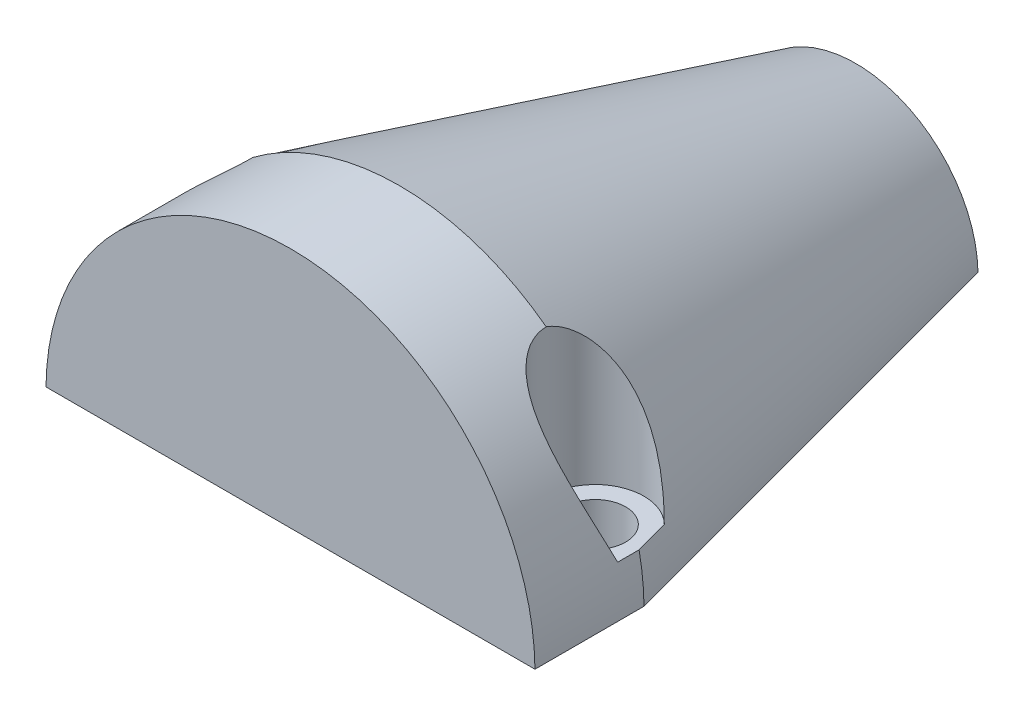
ISO-10303-21;
HEADER;
FILE_DESCRIPTION(('STEP AP214'),'2;1');
FILE_NAME('part.step','',(''),(''),'','','');
FILE_SCHEMA(('AUTOMOTIVE_DESIGN { 1 0 10303 214 1 1 1 1 }'));
ENDSEC;
DATA;
#1=APPLICATION_CONTEXT('core data for automotive mechanical design processes');
#2=APPLICATION_PROTOCOL_DEFINITION('international standard','automotive_design',2000,#1);
#3=PRODUCT_CONTEXT('',#1,'mechanical');
#4=PRODUCT('Part','Part','',(#3));
#5=PRODUCT_RELATED_PRODUCT_CATEGORY('part','',(#4));
#6=PRODUCT_DEFINITION_FORMATION('','',#4);
#7=PRODUCT_DEFINITION_CONTEXT('part definition',#1,'design');
#8=PRODUCT_DEFINITION('design','',#6,#7);
#9=PRODUCT_DEFINITION_SHAPE('','',#8);
#10=(LENGTH_UNIT() NAMED_UNIT(*) SI_UNIT(.MILLI.,.METRE.));
#11=(NAMED_UNIT(*) PLANE_ANGLE_UNIT() SI_UNIT($,.RADIAN.));
#12=(NAMED_UNIT(*) SI_UNIT($,.STERADIAN.) SOLID_ANGLE_UNIT());
#13=UNCERTAINTY_MEASURE_WITH_UNIT(LENGTH_MEASURE(1.E-05),#10,'distance_accuracy_value','');
#14=(GEOMETRIC_REPRESENTATION_CONTEXT(3) GLOBAL_UNCERTAINTY_ASSIGNED_CONTEXT((#13)) GLOBAL_UNIT_ASSIGNED_CONTEXT((#10,
#11,#12)) REPRESENTATION_CONTEXT('',''));
#15=CARTESIAN_POINT('',(0.,0.,0.));
#16=DIRECTION('',(0.,0.,1.));
#17=DIRECTION('',(1.,0.,0.));
#18=AXIS2_PLACEMENT_3D('',#15,#16,#17);
#19=CARTESIAN_POINT('',(0.,0.,-58.7248));
#20=DIRECTION('',(0.,0.,1.));
#21=DIRECTION('',(1.,0.,0.));
#22=AXIS2_PLACEMENT_3D('',#19,#20,#21);
#23=CYLINDRICAL_SURFACE('',#22,12.7);
#24=CARTESIAN_POINT('',(0.,0.,-35.0262773719376));
#25=DIRECTION('',(0.,0.,1.));
#26=DIRECTION('',(1.,0.,0.));
#27=AXIS2_PLACEMENT_3D('',#24,#25,#26);
#28=CIRCLE('',#27,12.7);
#29=CARTESIAN_POINT('',(7.62,10.16,-35.0262773719376));
#30=VERTEX_POINT('',#29);
#31=CARTESIAN_POINT('',(-7.62,10.16,-35.0262773719376));
#32=VERTEX_POINT('',#31);
#33=EDGE_CURVE('E112',#30,#32,#28,.T.);
#34=ORIENTED_EDGE('',*,*,#33,.T.);
#35=CARTESIAN_POINT('',(-12.4434078933385,2.54,-36.138773840534));
#36=CARTESIAN_POINT('',(-12.4106404932833,2.70051217003802,-36.2060156484439));
#37=CARTESIAN_POINT('',(-12.3746901179144,2.86079640095324,-36.2722713840303));
#38=CARTESIAN_POINT('',(-12.2963213923528,3.18082515908239,-36.4023243300552));
#39=CARTESIAN_POINT('',(-12.2539014911004,3.34056954745702,-36.466120946316));
#40=CARTESIAN_POINT('',(-12.162295816997,3.66009538455141,-36.5910249041812));
#41=CARTESIAN_POINT('',(-12.1130796355434,3.81987358225332,-36.6521184309757));
#42=CARTESIAN_POINT('',(-12.0079463618182,4.13852480136973,-36.7706887319838));
#43=CARTESIAN_POINT('',(-11.9520297748422,4.29739789009557,-36.828165778428));
#44=CARTESIAN_POINT('',(-11.7729807683343,4.7752753004494,-36.9952175468779));
#45=CARTESIAN_POINT('',(-11.6393290720681,5.09279377577872,-37.0983203245143));
#46=CARTESIAN_POINT('',(-11.4176934792722,5.56384285378942,-37.234737523135));
#47=CARTESIAN_POINT('',(-11.3403643685056,5.71985550880714,-37.2771417026836));
#48=CARTESIAN_POINT('',(-11.1785735557074,6.02992894801275,-37.3548313453031));
#49=CARTESIAN_POINT('',(-11.094114088835,6.18399032658193,-37.3901190275211));
#50=CARTESIAN_POINT('',(-10.9395956251811,6.45236552465443,-37.4447072475281));
#51=CARTESIAN_POINT('',(-10.8710602717988,6.5671936803413,-37.4658073446423));
#52=CARTESIAN_POINT('',(-10.7299775069151,6.79525994475454,-37.5025730887976));
#53=CARTESIAN_POINT('',(-10.657430098056,6.90849805452802,-37.5182387394176));
#54=CARTESIAN_POINT('',(-10.5084947684462,7.13299846972745,-37.543388886472));
#55=CARTESIAN_POINT('',(-10.4321100447159,7.24426231872844,-37.5528784393951));
#56=CARTESIAN_POINT('',(-10.2756347679032,7.4645549272482,-37.5648568501809));
#57=CARTESIAN_POINT('',(-10.1955442656979,7.57358371742274,-37.5673458041266));
#58=CARTESIAN_POINT('',(-10.0310991952555,7.79010386778702,-37.5643511210466));
#59=CARTESIAN_POINT('',(-9.94670866446787,7.89756703512684,-37.5587834357503));
#60=CARTESIAN_POINT('',(-9.77491926216904,8.10922502082775,-37.5384071584244));
#61=CARTESIAN_POINT('',(-9.68751988940299,8.21341928902977,-37.5235970195503));
#62=CARTESIAN_POINT('',(-9.51059020881198,8.41765309835135,-37.483527642801));
#63=CARTESIAN_POINT('',(-9.42106379815038,8.51769943578399,-37.4582863062521));
#64=CARTESIAN_POINT('',(-9.24084332787055,8.71289029340568,-37.3960522757407));
#65=CARTESIAN_POINT('',(-9.15015001711945,8.80803777878307,-37.3590667898374));
#66=CARTESIAN_POINT('',(-8.94620875107452,9.01562124603284,-37.2610318417203));
#67=CARTESIAN_POINT('',(-8.83300983497042,9.12640691631196,-37.1962732863556));
#68=CARTESIAN_POINT('',(-8.611084276837,9.33608426820649,-37.0438303176258));
#69=CARTESIAN_POINT('',(-8.50235231840917,9.43499037513306,-36.9561741281656));
#70=CARTESIAN_POINT('',(-8.31213273932098,9.60269835580483,-36.7731085236937));
#71=CARTESIAN_POINT('',(-8.22911529234959,9.6737731405652,-36.6813870394962));
#72=CARTESIAN_POINT('',(-8.07407892982588,9.8035433624046,-36.4810987927205));
#73=CARTESIAN_POINT('',(-8.00205759572734,9.86224152275256,-36.3725357449905));
#74=CARTESIAN_POINT('',(-7.90542931619484,9.93961410856828,-36.1980327923015));
#75=CARTESIAN_POINT('',(-7.87500540498989,9.96371312463023,-36.1376117280447));
#76=CARTESIAN_POINT('',(-7.81864864916133,10.0079974289445,-36.0133526991139));
#77=CARTESIAN_POINT('',(-7.7927134511465,10.0281847687208,-35.9495165480624));
#78=CARTESIAN_POINT('',(-7.74584851491928,10.064428103259,-35.8189199893317));
#79=CARTESIAN_POINT('',(-7.72491701596166,10.0804855514345,-35.7521606201131));
#80=CARTESIAN_POINT('',(-7.68848488166392,10.108299502319,-35.616332974433));
#81=CARTESIAN_POINT('',(-7.67298330590591,10.1200567498027,-35.5472651000576));
#82=CARTESIAN_POINT('',(-7.63872795073845,10.1459657408689,-35.3573387723015));
#83=CARTESIAN_POINT('',(-7.62558699532396,10.1558087690625,-35.2347924658732));
#84=CARTESIAN_POINT('',(-7.61729492135686,10.1620294764768,-34.9888527632129));
#85=CARTESIAN_POINT('',(-7.62213521643902,10.1584135825692,-34.8654597993654));
#86=CARTESIAN_POINT('',(-7.64849182384235,10.1385801329292,-34.6300487684962));
#87=CARTESIAN_POINT('',(-7.66885834202883,10.1232312576039,-34.5178257500126));
#88=CARTESIAN_POINT('',(-7.72371148857228,10.0814413221802,-34.2990785878541));
#89=CARTESIAN_POINT('',(-7.75819793428179,10.0550004055622,-34.1925543704827));
#90=CARTESIAN_POINT('',(-7.84067306320341,9.99082771120708,-33.9845398720463));
#91=CARTESIAN_POINT('',(-7.88903565999206,9.95278110270783,-33.8832963652108));
#92=CARTESIAN_POINT('',(-7.99635598713923,9.86676309569256,-33.6912251326956));
#93=CARTESIAN_POINT('',(-8.05531702805167,9.81878859536761,-33.6004006760975));
#94=CARTESIAN_POINT('',(-8.18842509008143,9.70813949365493,-33.4205431722038));
#95=CARTESIAN_POINT('',(-8.26353533978229,9.64441618805289,-33.3328733290485));
#96=CARTESIAN_POINT('',(-8.42046346179904,9.50771643598154,-33.1720208732124));
#97=CARTESIAN_POINT('',(-8.50228557481113,9.43473412331296,-33.098847520978));
#98=CARTESIAN_POINT('',(-8.71461003861574,9.2399023778972,-32.9312221295838));
#99=CARTESIAN_POINT('',(-8.84777980337395,9.11276606710865,-32.84626687126));
#100=CARTESIAN_POINT('',(-9.11581841077687,8.84465969539046,-32.7058688853343));
#101=CARTESIAN_POINT('',(-9.25069045469942,8.70365851539413,-32.6504944272678));
#102=CARTESIAN_POINT('',(-9.48124141176932,8.4508595407933,-32.5765170769203));
#103=CARTESIAN_POINT('',(-9.57770490946203,8.34140747217227,-32.5520298165436));
#104=CARTESIAN_POINT('',(-9.76775825440004,8.11802918179595,-32.5148777314228));
#105=CARTESIAN_POINT('',(-9.86134674383167,8.00410090218053,-32.5022184122377));
#106=CARTESIAN_POINT('',(-10.0448702014928,7.77254408245699,-32.4872163850711));
#107=CARTESIAN_POINT('',(-10.1348015117359,7.65491203670081,-32.4848837662466));
#108=CARTESIAN_POINT('',(-10.3104287800259,7.41666911221979,-32.4892147777491));
#109=CARTESIAN_POINT('',(-10.3961233187739,7.29605725529384,-32.4958814018951));
#110=CARTESIAN_POINT('',(-10.6117304097191,6.98111006257924,-32.5232164152447));
#111=CARTESIAN_POINT('',(-10.7381927119152,6.78491203169792,-32.5497933523737));
#112=CARTESIAN_POINT('',(-10.9790228403994,6.38788375166972,-32.6186863799452));
#113=CARTESIAN_POINT('',(-11.0933831702541,6.1870507241524,-32.6610121533767));
#114=CARTESIAN_POINT('',(-11.3101485362236,5.78131455829837,-32.7584771118828));
#115=CARTESIAN_POINT('',(-11.4125169216758,5.57640107261712,-32.813654113326));
#116=CARTESIAN_POINT('',(-11.6049736428323,5.16394939239367,-32.9342584089867));
#117=CARTESIAN_POINT('',(-11.6950649800691,4.95641185299676,-32.9996831893562));
#118=CARTESIAN_POINT('',(-11.8526798667538,4.56537913026074,-33.1300854898272));
#119=CARTESIAN_POINT('',(-11.9216167170454,4.38212530968016,-33.1940944374333));
#120=CARTESIAN_POINT('',(-12.0504395329373,4.01433341697475,-33.327329446642));
#121=CARTESIAN_POINT('',(-12.1103250388214,3.82979528011734,-33.3965557729668));
#122=CARTESIAN_POINT('',(-12.2206773107376,3.46145480480609,-33.5385864541603));
#123=CARTESIAN_POINT('',(-12.271227667386,3.2776619700238,-33.6113508549887));
#124=CARTESIAN_POINT('',(-12.3637261562958,2.90934458642097,-33.7602388553995));
#125=CARTESIAN_POINT('',(-12.405677114328,2.72482029833879,-33.8363613414877));
#126=CARTESIAN_POINT('',(-12.4434078933385,2.54,-33.9137809033413));
#127=B_SPLINE_CURVE_WITH_KNOTS('',3,(#35,#36,#37,#38,#39,#40,#41,#42,#43,#44,#45,#46,#47,#48,
#49,#50,#51,#52,#53,#54,#55,#56,#57,#58,#59,#60,#61,#62,#63,#64,#65,#66,#67,#68,#69,#70,#71,#72,
#73,#74,#75,#76,#77,#78,#79,#80,#81,#82,#83,#84,#85,#86,#87,#88,#89,#90,#91,#92,#93,#94,#95,#96,
#97,#98,#99,#100,#101,#102,#103,#104,#105,#106,#107,#108,#109,#110,#111,#112,#113,#114,#115,
#116,#117,#118,#119,#120,#121,#122,#123,#124,#125,#126),.UNSPECIFIED.,.F.,.F.,(4,2,2,2,2,2,2,2,
2,2,2,2,2,2,2,2,2,2,2,2,2,2,2,2,2,2,2,2,2,2,2,2,2,2,2,2,2,2,2,2,2,2,2,2,2,4),(0.,
0.531235424488071,1.06259841271496,1.59642094193124,2.1302032394547,3.20690310303408,
3.74432711486722,4.28158328102922,4.6875692311952,5.09355491398963,5.49920778904528,
5.90485509649544,6.31476481741373,6.72474316044887,7.13402082861732,7.54304778353178,
8.05467789637528,8.56568031927385,8.99205838740778,9.41834254005989,9.63350673900396,
9.8485577853311,10.0635330458599,10.2784710560176,10.6472414305073,11.0158357332595,
11.3595050560565,11.7031699334803,12.0571412780941,12.4112233827421,12.8053332210206,
13.1996940129701,13.8046003245861,14.4108967333143,14.8541195492621,15.2975485697704,
15.7414107237047,16.1854205756717,16.8891046682371,17.5932221296345,18.2994383247381,
19.0054815508635,19.6231710018872,20.2408918147059,20.8527802753675,21.4644673454182),.UNSPECIFIED.);
#128=CARTESIAN_POINT('',(-12.4434078933385,2.54,-33.9137809033413));
#129=VERTEX_POINT('',#128);
#130=EDGE_CURVE('E103',#32,#129,#127,.T.);
#131=ORIENTED_EDGE('',*,*,#130,.T.);
#132=DIRECTION('',(0.,0.,1.));
#133=VECTOR('',#132,1.);
#134=CARTESIAN_POINT('',(-12.4434078933385,2.54,-58.7248));
#135=LINE('',#134,#133);
#136=CARTESIAN_POINT('',(-12.4434078933385,2.54,-35.0262773719376));
#137=VERTEX_POINT('',#136);
#138=EDGE_CURVE('E96',#129,#137,#135,.F.);
#139=ORIENTED_EDGE('',*,*,#138,.T.);
#140=CARTESIAN_POINT('',(-12.6993649841242,0.127,-35.0262773719377));
#141=VERTEX_POINT('',#140);
#142=EDGE_CURVE('E210',#137,#141,#28,.T.);
#143=ORIENTED_EDGE('',*,*,#142,.T.);
#144=DIRECTION('',(0.,0.,1.));
#145=VECTOR('',#144,1.);
#146=CARTESIAN_POINT('',(-12.6993649841242,0.127,-58.7248));
#147=LINE('',#146,#145);
#148=CARTESIAN_POINT('',(-12.6993649841242,0.127,-29.3624));
#149=VERTEX_POINT('',#148);
#150=EDGE_CURVE('E164',#141,#149,#147,.T.);
#151=ORIENTED_EDGE('',*,*,#150,.T.);
#152=CARTESIAN_POINT('',(0.,0.,-29.3624));
#153=DIRECTION('',(0.,0.,-1.));
#154=DIRECTION('',(-1.,0.,0.));
#155=AXIS2_PLACEMENT_3D('',#152,#153,#154);
#156=CIRCLE('',#155,12.7);
#157=CARTESIAN_POINT('',(12.6993649841242,0.127,-29.3624));
#158=VERTEX_POINT('',#157);
#159=EDGE_CURVE('E158',#158,#149,#156,.F.);
#160=ORIENTED_EDGE('',*,*,#159,.F.);
#161=DIRECTION('',(0.,0.,1.));
#162=VECTOR('',#161,1.);
#163=CARTESIAN_POINT('',(12.6993649841242,0.127,-58.7248));
#164=LINE('',#163,#162);
#165=CARTESIAN_POINT('',(12.6993649841242,0.127,-35.0262773719376));
#166=VERTEX_POINT('',#165);
#167=EDGE_CURVE('E163',#166,#158,#164,.T.);
#168=ORIENTED_EDGE('',*,*,#167,.F.);
#169=CARTESIAN_POINT('',(12.4434078933385,2.54,-35.0262773719376));
#170=VERTEX_POINT('',#169);
#171=EDGE_CURVE('E226',#166,#170,#28,.T.);
#172=ORIENTED_EDGE('',*,*,#171,.T.);
#173=DIRECTION('',(0.,0.,1.));
#174=VECTOR('',#173,1.);
#175=CARTESIAN_POINT('',(12.4434078933385,2.54,-58.7248));
#176=LINE('',#175,#174);
#177=CARTESIAN_POINT('',(12.4434078933385,2.54,-33.9137809033413));
#178=VERTEX_POINT('',#177);
#179=EDGE_CURVE('E61',#178,#170,#176,.F.);
#180=ORIENTED_EDGE('',*,*,#179,.F.);
#181=CARTESIAN_POINT('',(12.4434078933385,2.54,-33.9137809033413));
#182=CARTESIAN_POINT('',(12.4106404932833,2.70051217003802,-33.8465390954314));
#183=CARTESIAN_POINT('',(12.3746901179144,2.86079640095324,-33.780283359845));
#184=CARTESIAN_POINT('',(12.2963213923528,3.18082515908239,-33.6502304138201));
#185=CARTESIAN_POINT('',(12.2539014911004,3.34056954745702,-33.5864337975593));
#186=CARTESIAN_POINT('',(12.162295816997,3.66009538455141,-33.4615298396941));
#187=CARTESIAN_POINT('',(12.1130796355434,3.81987358225332,-33.4004363128996));
#188=CARTESIAN_POINT('',(12.0079463618182,4.13852480136973,-33.2818660118915));
#189=CARTESIAN_POINT('',(11.9520297748422,4.29739789009557,-33.2243889654473));
#190=CARTESIAN_POINT('',(11.7729807683343,4.7752753004494,-33.0573371969974));
#191=CARTESIAN_POINT('',(11.6393290720681,5.09279377577873,-32.954234419361));
#192=CARTESIAN_POINT('',(11.4176934792722,5.56384285378942,-32.8178172207403));
#193=CARTESIAN_POINT('',(11.3403643685056,5.71985550880714,-32.7754130411917));
#194=CARTESIAN_POINT('',(11.1785735557074,6.02992894801275,-32.6977233985722));
#195=CARTESIAN_POINT('',(11.094114088835,6.18399032658193,-32.6624357163542));
#196=CARTESIAN_POINT('',(10.9395956251811,6.45236552465443,-32.6078474963472));
#197=CARTESIAN_POINT('',(10.8710602717988,6.5671936803413,-32.586747399233));
#198=CARTESIAN_POINT('',(10.7299775069151,6.79525994475454,-32.5499816550777));
#199=CARTESIAN_POINT('',(10.657430098056,6.90849805452802,-32.5343160044577));
#200=CARTESIAN_POINT('',(10.5084947684462,7.13299846972745,-32.5091658574033));
#201=CARTESIAN_POINT('',(10.4321100447159,7.24426231872844,-32.4996763044802));
#202=CARTESIAN_POINT('',(10.2756347679032,7.4645549272482,-32.4876978936944));
#203=CARTESIAN_POINT('',(10.1955442656979,7.57358371742274,-32.4852089397487));
#204=CARTESIAN_POINT('',(10.0310991952555,7.79010386778702,-32.4882036228287));
#205=CARTESIAN_POINT('',(9.94670866446787,7.89756703512684,-32.493771308125));
#206=CARTESIAN_POINT('',(9.77491926216904,8.10922502082775,-32.5141475854509));
#207=CARTESIAN_POINT('',(9.68751988940299,8.21341928902977,-32.528957724325));
#208=CARTESIAN_POINT('',(9.51059020881198,8.41765309835135,-32.5690271010743));
#209=CARTESIAN_POINT('',(9.42106379815038,8.51769943578399,-32.5942684376232));
#210=CARTESIAN_POINT('',(9.24084332787055,8.71289029340568,-32.6565024681346));
#211=CARTESIAN_POINT('',(9.15015001711945,8.80803777878307,-32.6934879540379));
#212=CARTESIAN_POINT('',(8.94620875107452,9.01562124603284,-32.791522902155));
#213=CARTESIAN_POINT('',(8.83300983497042,9.12640691631196,-32.8562814575196));
#214=CARTESIAN_POINT('',(8.611084276837,9.33608426820649,-33.0087244262495));
#215=CARTESIAN_POINT('',(8.50235231840917,9.43499037513306,-33.0963806157097));
#216=CARTESIAN_POINT('',(8.31213273932098,9.60269835580483,-33.2794462201816));
#217=CARTESIAN_POINT('',(8.22911529234959,9.6737731405652,-33.3711677043791));
#218=CARTESIAN_POINT('',(8.07407892982588,9.8035433624046,-33.5714559511548));
#219=CARTESIAN_POINT('',(8.00205759572734,9.86224152275256,-33.6800189988848));
#220=CARTESIAN_POINT('',(7.90542931619484,9.93961410856828,-33.8545219515738));
#221=CARTESIAN_POINT('',(7.87500540498989,9.96371312463023,-33.9149430158306));
#222=CARTESIAN_POINT('',(7.81864864916133,10.0079974289445,-34.0392020447614));
#223=CARTESIAN_POINT('',(7.7927134511465,10.0281847687208,-34.1030381958129));
#224=CARTESIAN_POINT('',(7.74584851491928,10.064428103259,-34.2336347545436));
#225=CARTESIAN_POINT('',(7.72491701596166,10.0804855514345,-34.3003941237622));
#226=CARTESIAN_POINT('',(7.68848488166392,10.108299502319,-34.4362217694423));
#227=CARTESIAN_POINT('',(7.67298330590591,10.1200567498027,-34.5052896438177));
#228=CARTESIAN_POINT('',(7.63872795073845,10.1459657408689,-34.6952159715738));
#229=CARTESIAN_POINT('',(7.62558699532396,10.1558087690625,-34.8177622780021));
#230=CARTESIAN_POINT('',(7.61729492135686,10.1620294764768,-35.0637019806624));
#231=CARTESIAN_POINT('',(7.62213521643902,10.1584135825692,-35.1870949445099));
#232=CARTESIAN_POINT('',(7.64849182384235,10.1385801329292,-35.4225059753791));
#233=CARTESIAN_POINT('',(7.66885834202883,10.1232312576039,-35.5347289938626));
#234=CARTESIAN_POINT('',(7.72371148857228,10.0814413221802,-35.7534761560212));
#235=CARTESIAN_POINT('',(7.75819793428179,10.0550004055622,-35.8600003733926));
#236=CARTESIAN_POINT('',(7.84067306320341,9.99082771120708,-36.068014871829));
#237=CARTESIAN_POINT('',(7.88903565999206,9.95278110270783,-36.1692583786645));
#238=CARTESIAN_POINT('',(7.99635598713923,9.86676309569256,-36.3613296111797));
#239=CARTESIAN_POINT('',(8.05531702805167,9.81878859536761,-36.4521540677778));
#240=CARTESIAN_POINT('',(8.18842509008143,9.70813949365493,-36.6320115716715));
#241=CARTESIAN_POINT('',(8.26353533978229,9.64441618805289,-36.7196814148268));
#242=CARTESIAN_POINT('',(8.42046346179903,9.50771643598154,-36.8805338706629));
#243=CARTESIAN_POINT('',(8.50228557481113,9.43473412331296,-36.9537072228973));
#244=CARTESIAN_POINT('',(8.71461003861574,9.2399023778972,-37.1213326142915));
#245=CARTESIAN_POINT('',(8.84777980337395,9.11276606710865,-37.2062878726152));
#246=CARTESIAN_POINT('',(9.11581841077687,8.84465969539046,-37.346685858541));
#247=CARTESIAN_POINT('',(9.25069045469942,8.70365851539413,-37.4020603166075));
#248=CARTESIAN_POINT('',(9.48124141176932,8.4508595407933,-37.476037666955));
#249=CARTESIAN_POINT('',(9.57770490946203,8.34140747217227,-37.5005249273317));
#250=CARTESIAN_POINT('',(9.76775825440004,8.11802918179595,-37.5376770124525));
#251=CARTESIAN_POINT('',(9.86134674383167,8.00410090218053,-37.5503363316376));
#252=CARTESIAN_POINT('',(10.0448702014928,7.77254408245699,-37.5653383588042));
#253=CARTESIAN_POINT('',(10.1348015117359,7.65491203670081,-37.5676709776287));
#254=CARTESIAN_POINT('',(10.3104287800259,7.41666911221979,-37.5633399661262));
#255=CARTESIAN_POINT('',(10.3961233187739,7.29605725529384,-37.5566733419802));
#256=CARTESIAN_POINT('',(10.6117304097191,6.98111006257924,-37.5293383286306));
#257=CARTESIAN_POINT('',(10.7381927119152,6.78491203169792,-37.5027613915016));
#258=CARTESIAN_POINT('',(10.9790228403994,6.38788375166972,-37.4338683639301));
#259=CARTESIAN_POINT('',(11.0933831702541,6.1870507241524,-37.3915425904986));
#260=CARTESIAN_POINT('',(11.3101485362236,5.78131455829837,-37.2940776319925));
#261=CARTESIAN_POINT('',(11.4125169216758,5.57640107261712,-37.2389006305493));
#262=CARTESIAN_POINT('',(11.6049736428323,5.16394939239367,-37.1182963348886));
#263=CARTESIAN_POINT('',(11.6950649800691,4.95641185299675,-37.0528715545191));
#264=CARTESIAN_POINT('',(11.8526798667538,4.56537913026074,-36.9224692540481));
#265=CARTESIAN_POINT('',(11.9216167170454,4.38212530968015,-36.858460306442));
#266=CARTESIAN_POINT('',(12.0504395329373,4.01433341697474,-36.7252252972333));
#267=CARTESIAN_POINT('',(12.1103250388214,3.82979528011733,-36.6559989709085));
#268=CARTESIAN_POINT('',(12.2206773107376,3.46145480480609,-36.513968289715));
#269=CARTESIAN_POINT('',(12.271227667386,3.2776619700238,-36.4412038888866));
#270=CARTESIAN_POINT('',(12.3637261562958,2.90934458642097,-36.2923158884758));
#271=CARTESIAN_POINT('',(12.405677114328,2.72482029833879,-36.2161934023876));
#272=CARTESIAN_POINT('',(12.4434078933385,2.54,-36.138773840534));
#273=B_SPLINE_CURVE_WITH_KNOTS('',3,(#181,#182,#183,#184,#185,#186,#187,#188,#189,#190,#191,
#192,#193,#194,#195,#196,#197,#198,#199,#200,#201,#202,#203,#204,#205,#206,#207,#208,#209,#210,
#211,#212,#213,#214,#215,#216,#217,#218,#219,#220,#221,#222,#223,#224,#225,#226,#227,#228,#229,
#230,#231,#232,#233,#234,#235,#236,#237,#238,#239,#240,#241,#242,#243,#244,#245,#246,#247,#248,
#249,#250,#251,#252,#253,#254,#255,#256,#257,#258,#259,#260,#261,#262,#263,#264,#265,#266,#267,
#268,#269,#270,#271,#272),.UNSPECIFIED.,.F.,.F.,(4,2,2,2,2,2,2,2,2,2,2,2,2,2,2,2,2,2,2,2,2,2,2,
2,2,2,2,2,2,2,2,2,2,2,2,2,2,2,2,2,2,2,2,2,2,4),(0.,0.531235424488071,1.06259841271496,
1.59642094193124,2.1302032394547,3.20690310303408,3.74432711486722,4.28158328102922,
4.6875692311952,5.09355491398963,5.49920778904528,5.90485509649544,6.31476481741373,
6.72474316044887,7.13402082861732,7.54304778353178,8.05467789637527,8.56568031927385,
8.99205838740778,9.41834254005989,9.63350673900396,9.8485577853311,10.0635330458599,
10.2784710560176,10.6472414305073,11.0158357332595,11.3595050560565,11.7031699334803,
12.0571412780941,12.4112233827421,12.8053332210205,13.1996940129701,13.8046003245861,
14.4108967333143,14.8541195492621,15.2975485697704,15.7414107237047,16.1854205756717,
16.8891046682371,17.5932221296345,18.2994383247381,19.0054815508635,19.6231710018872,
20.2408918147059,20.8527802753675,21.4644673454182),.UNSPECIFIED.);
#274=EDGE_CURVE('E144',#178,#30,#273,.T.);
#275=ORIENTED_EDGE('',*,*,#274,.T.);
#276=EDGE_LOOP('',(#34,#131,#139,#143,#151,#160,#168,#172,#180,#275));
#277=FACE_BOUND('',#276,.T.);
#278=ADVANCED_FACE('F33',(#277),#23,.T.);
#279=CARTESIAN_POINT('',(0.,0.,-35.0262773719376));
#280=DIRECTION('',(0.,0.,1.));
#281=DIRECTION('',(1.,0.,0.));
#282=AXIS2_PLACEMENT_3D('',#279,#280,#281);
#283=CONICAL_SURFACE('',#282,12.7,0.26179938779915);
#284=CARTESIAN_POINT('',(-14.8998146312197,2.54,-26.0142572542949));
#285=CARTESIAN_POINT('',(-14.6532920343515,2.54,-26.9212044294831));
#286=CARTESIAN_POINT('',(-14.4066109080176,2.54,-27.8281084944786));
#287=CARTESIAN_POINT('',(-13.9128728262181,2.54,-29.641814464323));
#288=CARTESIAN_POINT('',(-13.6658158706929,2.54,-30.5486163691555));
#289=CARTESIAN_POINT('',(-12.9239943569968,2.54,-33.2688403415854));
#290=CARTESIAN_POINT('',(-12.4285780212226,2.54,-35.0820848282492));
#291=CARTESIAN_POINT('',(-11.6835977280713,2.54,-37.8014447562093));
#292=CARTESIAN_POINT('',(-11.4349614598359,2.54,-38.7078143450266));
#293=CARTESIAN_POINT('',(-10.9369320521495,2.54,-40.5203454380746));
#294=CARTESIAN_POINT('',(-10.6875389128216,2.54,-41.4265069423392));
#295=CARTESIAN_POINT('',(-10.1878286528767,2.54,-43.2385773919817));
#296=CARTESIAN_POINT('',(-9.93751153024949,2.54,-44.1444863368056));
#297=CARTESIAN_POINT('',(-9.43570515783591,2.54,-45.9559800300714));
#298=CARTESIAN_POINT('',(-9.18421590738225,2.54,-46.8615647783284));
#299=CARTESIAN_POINT('',(-8.93201639243483,2.54,-47.7669520804676));
#300=B_SPLINE_CURVE_WITH_KNOTS('',3,(#284,#285,#286,#287,#288,#289,#290,#291,#292,#293,#294,
#295,#296,#297,#298,#299),.UNSPECIFIED.,.F.,.F.,(4,2,2,2,2,2,2,4),(0.,2.81956357541145,
5.63912759864496,11.278242709226,14.0978049103089,16.9173666530588,19.736934533939,
22.5565040201744),.UNSPECIFIED.);
#301=CARTESIAN_POINT('',(-11.9502444312223,2.54,-36.8281166756708));
#302=VERTEX_POINT('',#301);
#303=EDGE_CURVE('E99',#137,#302,#300,.T.);
#304=ORIENTED_EDGE('',*,*,#303,.T.);
#305=CARTESIAN_POINT('',(-11.9503028355487,2.53980000000197,-36.8280586452964));
#306=CARTESIAN_POINT('',(-11.9027565953451,2.70253805454104,-36.8753401969849));
#307=CARTESIAN_POINT('',(-11.8519626602574,2.86450696910424,-36.9220304776196));
#308=CARTESIAN_POINT('',(-11.7440679791614,3.1870495855481,-37.0130522095484));
#309=CARTESIAN_POINT('',(-11.6869655865028,3.3476229112945,-37.0573830404771));
#310=CARTESIAN_POINT('',(-11.5663642209751,3.66823905354584,-37.1426982582071));
#311=CARTESIAN_POINT('',(-11.5028344318371,3.82827510712434,-37.1836646346098));
#312=CARTESIAN_POINT('',(-11.3697752266962,4.14694868583156,-37.2609948369044));
#313=CARTESIAN_POINT('',(-11.3002463480957,4.30558633483,-37.2973590743404));
#314=CARTESIAN_POINT('',(-11.1546949484316,4.62280213136169,-37.3647971939368));
#315=CARTESIAN_POINT('',(-11.0786196107062,4.78136689055199,-37.395820510911));
#316=CARTESIAN_POINT('',(-10.9207212899991,5.09683700431684,-37.4511282655765));
#317=CARTESIAN_POINT('',(-10.8388976703187,5.25374217284813,-37.4754119552853));
#318=CARTESIAN_POINT('',(-10.6700048136945,5.56525910778126,-37.5160607800382));
#319=CARTESIAN_POINT('',(-10.5829488296669,5.71987552685168,-37.5324450454376));
#320=CARTESIAN_POINT('',(-10.4038293493354,6.02687835296502,-37.5561604192189));
#321=CARTESIAN_POINT('',(-10.3117667196262,6.17926514017428,-37.5634930891574));
#322=CARTESIAN_POINT('',(-10.1478188244754,6.44199623299672,-37.5672034161167));
#323=CARTESIAN_POINT('',(-10.0769383550365,6.55293330341813,-37.5659407433624));
#324=CARTESIAN_POINT('',(-9.93309415675967,6.77318087276109,-37.5571485046828));
#325=CARTESIAN_POINT('',(-9.86013033281468,6.88249129707707,-37.5496186522116));
#326=CARTESIAN_POINT('',(-9.6389005485118,7.20732063315158,-37.5167110040605));
#327=CARTESIAN_POINT('',(-9.48798988583111,7.4202254085298,-37.4810274113702));
#328=CARTESIAN_POINT('',(-9.25947872532692,7.73310973633931,-37.4026647001482));
#329=CARTESIAN_POINT('',(-9.18259641637861,7.83678191156817,-37.3722083263233));
#330=CARTESIAN_POINT('',(-9.02918522097152,8.04126788335253,-37.302230809972));
#331=CARTESIAN_POINT('',(-8.95265620232696,8.14208283638823,-37.2627133955847));
#332=CARTESIAN_POINT('',(-8.80100427351081,8.34039174667304,-37.173937771692));
#333=CARTESIAN_POINT('',(-8.7258808219333,8.43788699500838,-37.1246834009612));
#334=CARTESIAN_POINT('',(-8.57833615514212,8.62901875931164,-37.0158357214586));
#335=CARTESIAN_POINT('',(-8.5059139720983,8.72265665859923,-36.9562461597409));
#336=CARTESIAN_POINT('',(-8.33405809280067,8.94606018560009,-36.7973363765007));
#337=CARTESIAN_POINT('',(-8.23687152236609,9.07345349174439,-36.692110021135));
#338=CARTESIAN_POINT('',(-8.05694666333908,9.31659835179753,-36.4582278102061));
#339=CARTESIAN_POINT('',(-7.97419928593815,9.43235720945502,-36.3295867980526));
#340=CARTESIAN_POINT('',(-7.84354981615659,9.62878479877949,-36.0760508040565));
#341=CARTESIAN_POINT('',(-7.79202308856719,9.71196277524565,-35.9549786840976));
#342=CARTESIAN_POINT('',(-7.70723521728229,9.86632250694656,-35.6997152641933));
#343=CARTESIAN_POINT('',(-7.67392079292312,9.93753882827303,-35.5655636005583));
#344=CARTESIAN_POINT('',(-7.64137836222283,10.0312355116027,-35.3616354371319));
#345=CARTESIAN_POINT('',(-7.63344858711602,10.0594227545776,-35.295766657141));
#346=CARTESIAN_POINT('',(-7.62275345521967,10.1123855290361,-35.1621894264283));
#347=CARTESIAN_POINT('',(-7.61999333479352,10.1371575777607,-35.0944791808092));
#348=CARTESIAN_POINT('',(-7.62000000787402,10.1600669813131,-35.0260773719376));
#349=B_SPLINE_CURVE_WITH_KNOTS('',3,(#305,#306,#307,#308,#309,#310,#311,#312,#313,#314,#315,
#316,#317,#318,#319,#320,#321,#322,#323,#324,#325,#326,#327,#328,#329,#330,#331,#332,#333,#334,
#335,#336,#337,#338,#339,#340,#341,#342,#343,#344,#345,#346,#347,#348),.UNSPECIFIED.,.F.,.F.,(4,
2,2,2,2,2,2,2,2,2,2,2,2,2,2,2,2,2,2,2,2,4),(0.,0.52801276868113,1.05616368774751,
1.58697902776132,2.11774686625586,2.65329219432073,3.18889693494686,3.72319798216456,
4.25740684034089,4.65219313297487,5.0469974768855,5.83488566594667,6.23246051113895,
6.62987206790833,7.02712725735392,7.42423872067559,7.99727532017098,8.56994990801895,
9.03521317592912,9.49910791649679,9.71510714592713,9.93132504374708),.UNSPECIFIED.);
#350=EDGE_CURVE('E11',#302,#32,#349,.T.);
#351=ORIENTED_EDGE('',*,*,#350,.T.);
#352=ORIENTED_EDGE('',*,*,#33,.F.);
#353=CARTESIAN_POINT('',(7.62000000787402,10.1600669813131,-35.0260773719377));
#354=CARTESIAN_POINT('',(7.61998520234651,10.1360516333332,-35.0977959109944));
#355=CARTESIAN_POINT('',(7.62302534675887,10.1099718328177,-35.1687784183576));
#356=CARTESIAN_POINT('',(7.63477574494964,10.0540746439135,-35.3086789655192));
#357=CARTESIAN_POINT('',(7.64347894783701,10.0242619404679,-35.3775994611966));
#358=CARTESIAN_POINT('',(7.66602684515066,9.96148202212725,-35.5124205342766));
#359=CARTESIAN_POINT('',(7.6798296679004,9.92854207703338,-35.5783409263714));
#360=CARTESIAN_POINT('',(7.71211940472766,9.85962022346055,-35.7073861735789));
#361=CARTESIAN_POINT('',(7.73060776455503,9.82363737836454,-35.7705101587684));
#362=CARTESIAN_POINT('',(7.79219425937615,9.71193599677309,-35.954585440134));
#363=CARTESIAN_POINT('',(7.84155389103124,9.63209792160489,-36.0710202706731));
#364=CARTESIAN_POINT('',(7.95342851901411,9.46329710998814,-36.2903471741123));
#365=CARTESIAN_POINT('',(8.01597458002877,9.37431308572313,-36.39320631806));
#366=CARTESIAN_POINT('',(8.18566266553109,9.14091749372081,-36.6340945933956));
#367=CARTESIAN_POINT('',(8.29917028155745,8.99158445072606,-36.762910697763));
#368=CARTESIAN_POINT('',(8.5388799297318,8.67965271547712,-36.9886203894909));
#369=CARTESIAN_POINT('',(8.66510272415922,8.51703241133148,-37.0854606243874));
#370=CARTESIAN_POINT('',(8.88488825433432,8.23100109057781,-37.2256701009138));
#371=CARTESIAN_POINT('',(8.97716201895472,8.11009277580953,-37.2763909143126));
#372=CARTESIAN_POINT('',(9.16245249710581,7.86398085432394,-37.3644444607119));
#373=CARTESIAN_POINT('',(9.2554694981303,7.73877551694576,-37.4017717283449));
#374=CARTESIAN_POINT('',(9.44075708566442,7.48469867414223,-37.4642806944153));
#375=CARTESIAN_POINT('',(9.53302692166529,7.35582395781726,-37.4894513862917));
#376=CARTESIAN_POINT('',(9.71561691601887,7.0950353085486,-37.5288455958875));
#377=CARTESIAN_POINT('',(9.80593644186589,6.96312041748825,-37.5430656125162));
#378=CARTESIAN_POINT('',(10.0308119644351,6.62618703905763,-37.5666736303411));
#379=CARTESIAN_POINT('',(10.1634761687963,6.41943497020576,-37.5695192683935));
#380=CARTESIAN_POINT('',(10.4200619094499,6.00114717192369,-37.5561950126637));
#381=CARTESIAN_POINT('',(10.5439783369583,5.7896087408886,-37.5400141030078));
#382=CARTESIAN_POINT('',(10.7820286450931,5.3622068528258,-37.4919331767307));
#383=CARTESIAN_POINT('',(10.8961374652537,5.146333958932,-37.4599942196692));
#384=CARTESIAN_POINT('',(11.1134018568547,4.71147586969587,-37.3833701513144));
#385=CARTESIAN_POINT('',(11.2165604370522,4.49249154811745,-37.3386885537739));
#386=CARTESIAN_POINT('',(11.3770674477757,4.12951318705375,-37.2568284336466));
#387=CARTESIAN_POINT('',(11.4377410719852,3.98630935713544,-37.2225613101154));
#388=CARTESIAN_POINT('',(11.5541856274768,3.6988009278943,-37.1505498469211));
#389=CARTESIAN_POINT('',(11.6099570271887,3.55449643518,-37.1128058401975));
#390=CARTESIAN_POINT('',(11.7161131120466,3.26580830143116,-37.0348609497346));
#391=CARTESIAN_POINT('',(11.7665329577551,3.12143237057704,-36.9946792344992));
#392=CARTESIAN_POINT('',(11.8622772613498,2.83151365729066,-36.9125058331347));
#393=CARTESIAN_POINT('',(11.9076018283043,2.68597089990673,-36.8705141857751));
#394=CARTESIAN_POINT('',(11.9503028355487,2.53980000000197,-36.8280586452964));
#395=B_SPLINE_CURVE_WITH_KNOTS('',3,(#353,#354,#355,#356,#357,#358,#359,#360,#361,#362,#363,
#364,#365,#366,#367,#368,#369,#370,#371,#372,#373,#374,#375,#376,#377,#378,#379,#380,#381,#382,
#383,#384,#385,#386,#387,#388,#389,#390,#391,#392,#393,#394),.UNSPECIFIED.,.F.,.F.,(4,2,2,2,2,2,
2,2,2,2,2,2,2,2,2,2,2,2,2,2,4),(0.,0.226741935529759,0.453202100804092,0.67784274858591,
0.902552795124065,1.34938295408081,1.79727776235399,2.47612136065011,3.15609196774388,
3.63646522805228,4.1170342870495,4.59803764125938,5.07919471549176,5.8150504647756,
6.55133246516168,7.28944310844537,8.02735041594133,8.50501428787409,8.98263246712659,
9.45688798482363,9.93113334877009),.UNSPECIFIED.);
#396=CARTESIAN_POINT('',(11.9502444312223,2.54,-36.8281166756708));
#397=VERTEX_POINT('',#396);
#398=EDGE_CURVE('E46',#30,#397,#395,.T.);
#399=ORIENTED_EDGE('',*,*,#398,.T.);
#400=CARTESIAN_POINT('',(14.8998146312197,2.54,-26.0142572542949));
#401=CARTESIAN_POINT('',(14.6532920343515,2.54,-26.9212044294831));
#402=CARTESIAN_POINT('',(14.4066109080176,2.54,-27.8281084944786));
#403=CARTESIAN_POINT('',(13.9128728262181,2.54,-29.641814464323));
#404=CARTESIAN_POINT('',(13.6658158706929,2.54,-30.5486163691555));
#405=CARTESIAN_POINT('',(12.9239943569968,2.54,-33.2688403415854));
#406=CARTESIAN_POINT('',(12.4285780212226,2.54,-35.0820848282492));
#407=CARTESIAN_POINT('',(11.6835977280713,2.54,-37.8014447562093));
#408=CARTESIAN_POINT('',(11.4349614598359,2.54,-38.7078143450266));
#409=CARTESIAN_POINT('',(10.9369320521495,2.54,-40.5203454380746));
#410=CARTESIAN_POINT('',(10.6875389128216,2.54,-41.4265069423392));
#411=CARTESIAN_POINT('',(10.1878286528767,2.54,-43.2385773919817));
#412=CARTESIAN_POINT('',(9.93751153024949,2.54,-44.1444863368056));
#413=CARTESIAN_POINT('',(9.43570515783591,2.54,-45.9559800300714));
#414=CARTESIAN_POINT('',(9.18421590738225,2.54,-46.8615647783284));
#415=CARTESIAN_POINT('',(8.93201639243483,2.54,-47.7669520804676));
#416=B_SPLINE_CURVE_WITH_KNOTS('',3,(#400,#401,#402,#403,#404,#405,#406,#407,#408,#409,#410,
#411,#412,#413,#414,#415),.UNSPECIFIED.,.F.,.F.,(4,2,2,2,2,2,2,4),(0.,2.81956357541145,
5.63912759864496,11.278242709226,14.0978049103089,16.9173666530588,19.736934533939,
22.5565040201744),.UNSPECIFIED.);
#417=EDGE_CURVE('E138',#170,#397,#416,.T.);
#418=ORIENTED_EDGE('',*,*,#417,.F.);
#419=ORIENTED_EDGE('',*,*,#171,.F.);
#420=CARTESIAN_POINT('',(1.94321325390739,0.127,-75.1556802106432));
#421=CARTESIAN_POINT('',(2.07693782172452,0.127,-74.6576636055089));
#422=CARTESIAN_POINT('',(2.21061493467501,0.127,-74.1596342631324));
#423=CARTESIAN_POINT('',(2.4779048848408,0.127,-73.1635583343275));
#424=CARTESIAN_POINT('',(2.61151772205667,0.127,-72.6655117478992));
#425=CARTESIAN_POINT('',(3.27949780739585,0.127,-70.1752562682907));
#426=CARTESIAN_POINT('',(3.81361275974789,0.127,-68.1829797086749));
#427=CARTESIAN_POINT('',(4.88172149259025,0.127,-64.1983940980424));
#428=CARTESIAN_POINT('',(5.41571527307923,0.127,-62.2060850470255));
#429=CARTESIAN_POINT('',(6.17070630762112,0.127,-59.3890634678594));
#430=CARTESIAN_POINT('',(6.39173005385989,0.127,-58.5643580414284));
#431=CARTESIAN_POINT('',(7.51948176410368,0.127,-54.3563085671456));
#432=CARTESIAN_POINT('',(8.42615390730133,0.127,-50.9729495601073));
#433=CARTESIAN_POINT('',(11.1461151050432,0.127,-40.8228577234835));
#434=CARTESIAN_POINT('',(12.95934892398,0.127,-34.0561100924051));
#435=CARTESIAN_POINT('',(16.5857632951932,0.127,-20.5226005869961));
#436=CARTESIAN_POINT('',(18.3989438474698,0.127,-13.7558387126656));
#437=CARTESIAN_POINT('',(20.2121447880913,0.127,-6.98908230230757));
#438=B_SPLINE_CURVE_WITH_KNOTS('',3,(#420,#421,#422,#423,#424,#425,#426,#427,#428,#429,#430,
#431,#432,#433,#434,#435,#436,#437),.UNSPECIFIED.,.F.,.F.,(4,2,2,2,2,2,2,2,4),(0.,
1.54697290308262,3.09394579285215,9.28183732704608,15.469728929613,18.0311572087203,
28.5393708010859,49.5557980293496,70.5722251703422),.UNSPECIFIED.);
#439=CARTESIAN_POINT('',(6.34872987297459,0.127,-58.7248));
#440=VERTEX_POINT('',#439);
#441=EDGE_CURVE('E167',#440,#166,#438,.T.);
#442=ORIENTED_EDGE('',*,*,#441,.F.);
#443=CARTESIAN_POINT('',(0.,0.,-58.7248));
#444=DIRECTION('',(0.,0.,1.));
#445=DIRECTION('',(1.,0.,0.));
#446=AXIS2_PLACEMENT_3D('',#443,#444,#445);
#447=CIRCLE('',#446,6.35);
#448=CARTESIAN_POINT('',(-6.34872987297459,0.127,-58.7248));
#449=VERTEX_POINT('',#448);
#450=EDGE_CURVE('E223',#449,#440,#447,.F.);
#451=ORIENTED_EDGE('',*,*,#450,.F.);
#452=CARTESIAN_POINT('',(-20.8622535877323,0.127,-4.56288963234481));
#453=CARTESIAN_POINT('',(-19.4324065697796,0.127,-9.89903762991192));
#454=CARTESIAN_POINT('',(-18.0025609559455,0.127,-15.2351860038888));
#455=CARTESIAN_POINT('',(-15.1428480000051,0.127,-25.9074769124702));
#456=CARTESIAN_POINT('',(-13.7129806578987,0.127,-31.2436194470749));
#457=CARTESIAN_POINT('',(-11.3735297632676,0.127,-39.9740985345265));
#458=CARTESIAN_POINT('',(-10.4639599856333,0.127,-43.3684387785588));
#459=CARTESIAN_POINT('',(-8.64478241025165,0.127,-50.157109086779));
#460=CARTESIAN_POINT('',(-7.73517461250425,0.127,-53.5514391509669));
#461=CARTESIAN_POINT('',(-6.35756978230895,0.127,-58.6918364047972));
#462=CARTESIAN_POINT('',(-5.88961280046199,0.127,-60.4379143277253));
#463=CARTESIAN_POINT('',(-4.9536412666387,0.127,-63.9300547364165));
#464=CARTESIAN_POINT('',(-4.48562671466262,0.127,-65.6761172221795));
#465=CARTESIAN_POINT('',(-3.68243522717848,0.127,-68.6721741829996));
#466=CARTESIAN_POINT('',(-3.3472923346889,0.127,-69.9221777837294));
#467=CARTESIAN_POINT('',(-2.84445002492435,0.127,-71.7971488744631));
#468=CARTESIAN_POINT('',(-2.67681459241727,0.127,-72.4221335224321));
#469=CARTESIAN_POINT('',(-2.34146023968684,0.127,-73.6720804228785));
#470=CARTESIAN_POINT('',(-2.17374131946289,0.127,-74.2970426753558));
#471=CARTESIAN_POINT('',(-2.00596024098185,0.127,-74.9219882471763));
#472=B_SPLINE_CURVE_WITH_KNOTS('',3,(#452,#453,#454,#455,#456,#457,#458,#459,#460,#461,#462,
#463,#464,#465,#466,#467,#468,#469,#470,#471),.UNSPECIFIED.,.F.,.F.,(4,2,2,2,2,2,2,2,2,4),(0.,
16.5731844112756,33.1463687729533,43.6886534330661,54.2309381167873,59.6540319427042,
65.07712574622,68.9595821597866,70.9008103838685,72.8420386218866),.UNSPECIFIED.);
#473=EDGE_CURVE('E175',#141,#449,#472,.T.);
#474=ORIENTED_EDGE('',*,*,#473,.F.);
#475=ORIENTED_EDGE('',*,*,#142,.F.);
#476=EDGE_LOOP('',(#304,#351,#352,#399,#418,#419,#442,#451,#474,#475));
#477=FACE_BOUND('',#476,.T.);
#478=ADVANCED_FACE('F35',(#477),#283,.T.);
#479=CARTESIAN_POINT('',(-10.16,0.127,-35.0262773719376));
#480=DIRECTION('',(0.,1.,0.));
#481=DIRECTION('',(0.,0.,1.));
#482=AXIS2_PLACEMENT_3D('',#479,#480,#481);
#483=CYLINDRICAL_SURFACE('',#482,1.5875);
#484=CARTESIAN_POINT('',(-10.16,0.127,-35.0262773719376));
#485=DIRECTION('',(0.,-1.,0.));
#486=DIRECTION('',(0.,0.,1.));
#487=AXIS2_PLACEMENT_3D('',#484,#485,#486);
#488=CIRCLE('',#487,1.5875);
#489=CARTESIAN_POINT('',(-10.16,0.127,-33.4387773719376));
#490=VERTEX_POINT('',#489);
#491=EDGE_CURVE('E149',#490,#490,#488,.T.);
#492=ORIENTED_EDGE('',*,*,#491,.T.);
#493=EDGE_LOOP('',(#492));
#494=FACE_BOUND('',#493,.T.);
#495=CARTESIAN_POINT('',(-10.16,2.54,-35.0262773719376));
#496=DIRECTION('',(0.,1.,0.));
#497=DIRECTION('',(0.,0.,1.));
#498=AXIS2_PLACEMENT_3D('',#495,#496,#497);
#499=CIRCLE('',#498,1.5875);
#500=CARTESIAN_POINT('',(-10.16,2.54,-33.4387773719376));
#501=VERTEX_POINT('',#500);
#502=EDGE_CURVE('E107',#501,#501,#499,.T.);
#503=ORIENTED_EDGE('',*,*,#502,.T.);
#504=EDGE_LOOP('',(#503));
#505=FACE_BOUND('',#504,.T.);
#506=ADVANCED_FACE('F185',(#494,#505),#483,.F.);
#507=CARTESIAN_POINT('',(0.,0.127,-58.7248));
#508=DIRECTION('',(0.,1.,0.));
#509=DIRECTION('',(0.,0.,1.));
#510=AXIS2_PLACEMENT_3D('',#507,#508,#509);
#511=PLANE('',#510);
#512=CARTESIAN_POINT('',(10.16,0.127,-35.0262773719376));
#513=DIRECTION('',(0.,-1.,0.));
#514=DIRECTION('',(0.,0.,-1.));
#515=AXIS2_PLACEMENT_3D('',#512,#513,#514);
#516=CIRCLE('',#515,1.5875);
#517=CARTESIAN_POINT('',(10.16,0.127,-36.6137773719376));
#518=VERTEX_POINT('',#517);
#519=EDGE_CURVE('E152',#518,#518,#516,.T.);
#520=ORIENTED_EDGE('',*,*,#519,.F.);
#521=EDGE_LOOP('',(#520));
#522=FACE_BOUND('',#521,.T.);
#523=ORIENTED_EDGE('',*,*,#167,.T.);
#524=DIRECTION('',(-1.,0.,0.));
#525=VECTOR('',#524,1.);
#526=CARTESIAN_POINT('',(0.,0.127,-29.3624));
#527=LINE('',#526,#525);
#528=EDGE_CURVE('E155',#158,#149,#527,.T.);
#529=ORIENTED_EDGE('',*,*,#528,.T.);
#530=ORIENTED_EDGE('',*,*,#150,.F.);
#531=ORIENTED_EDGE('',*,*,#473,.T.);
#532=DIRECTION('',(-1.,0.,0.));
#533=VECTOR('',#532,1.);
#534=CARTESIAN_POINT('',(0.,0.127,-58.7248));
#535=LINE('',#534,#533);
#536=EDGE_CURVE('E160',#440,#449,#535,.T.);
#537=ORIENTED_EDGE('',*,*,#536,.F.);
#538=ORIENTED_EDGE('',*,*,#441,.T.);
#539=EDGE_LOOP('',(#523,#529,#530,#531,#537,#538));
#540=FACE_BOUND('',#539,.T.);
#541=ORIENTED_EDGE('',*,*,#491,.F.);
#542=EDGE_LOOP('',(#541));
#543=FACE_BOUND('',#542,.T.);
#544=ADVANCED_FACE('F180',(#522,#540,#543),#511,.F.);
#545=CARTESIAN_POINT('',(0.,0.,-58.7248));
#546=DIRECTION('',(0.,0.,1.));
#547=DIRECTION('',(1.,0.,0.));
#548=AXIS2_PLACEMENT_3D('',#545,#546,#547);
#549=PLANE('',#548);
#550=ORIENTED_EDGE('',*,*,#450,.T.);
#551=ORIENTED_EDGE('',*,*,#536,.T.);
#552=EDGE_LOOP('',(#550,#551));
#553=FACE_BOUND('',#552,.T.);
#554=ADVANCED_FACE('F184',(#553),#549,.F.);
#555=CARTESIAN_POINT('',(0.,0.127,-29.3624));
#556=DIRECTION('',(0.,0.,-1.));
#557=DIRECTION('',(-1.,0.,0.));
#558=AXIS2_PLACEMENT_3D('',#555,#556,#557);
#559=PLANE('',#558);
#560=ORIENTED_EDGE('',*,*,#159,.T.);
#561=ORIENTED_EDGE('',*,*,#528,.F.);
#562=EDGE_LOOP('',(#560,#561));
#563=FACE_BOUND('',#562,.T.);
#564=ADVANCED_FACE('F187',(#563),#559,.F.);
#565=CARTESIAN_POINT('',(10.16,0.127,-35.0262773719376));
#566=DIRECTION('',(0.,1.,0.));
#567=DIRECTION('',(0.,0.,1.));
#568=AXIS2_PLACEMENT_3D('',#565,#566,#567);
#569=CYLINDRICAL_SURFACE('',#568,1.5875);
#570=CARTESIAN_POINT('',(10.16,2.54,-35.0262773719376));
#571=DIRECTION('',(0.,-1.,0.));
#572=DIRECTION('',(0.,0.,-1.));
#573=AXIS2_PLACEMENT_3D('',#570,#571,#572);
#574=CIRCLE('',#573,1.5875);
#575=CARTESIAN_POINT('',(10.16,2.54,-36.6137773719376));
#576=VERTEX_POINT('',#575);
#577=EDGE_CURVE('E116',#576,#576,#574,.T.);
#578=ORIENTED_EDGE('',*,*,#577,.F.);
#579=EDGE_LOOP('',(#578));
#580=FACE_BOUND('',#579,.T.);
#581=ORIENTED_EDGE('',*,*,#519,.T.);
#582=EDGE_LOOP('',(#581));
#583=FACE_BOUND('',#582,.T.);
#584=ADVANCED_FACE('F196',(#580,#583),#569,.F.);
#585=CARTESIAN_POINT('',(10.16,2.54,-35.0262773719376));
#586=DIRECTION('',(0.,1.,0.));
#587=DIRECTION('',(0.,0.,1.));
#588=AXIS2_PLACEMENT_3D('',#585,#586,#587);
#589=CYLINDRICAL_SURFACE('',#588,2.54);
#590=CARTESIAN_POINT('',(10.16,2.54,-35.0262773719376));
#591=DIRECTION('',(0.,-1.,0.));
#592=DIRECTION('',(0.,0.,-1.));
#593=AXIS2_PLACEMENT_3D('',#590,#591,#592);
#594=CIRCLE('',#593,2.54);
#595=EDGE_CURVE('E113',#178,#397,#594,.T.);
#596=ORIENTED_EDGE('',*,*,#595,.T.);
#597=ORIENTED_EDGE('',*,*,#398,.F.);
#598=ORIENTED_EDGE('',*,*,#274,.F.);
#599=EDGE_LOOP('',(#596,#597,#598));
#600=FACE_BOUND('',#599,.T.);
#601=ADVANCED_FACE('F135',(#600),#589,.F.);
#602=CARTESIAN_POINT('',(10.16,2.54,-35.0262773719376));
#603=DIRECTION('',(0.,-1.,0.));
#604=DIRECTION('',(0.,0.,-1.));
#605=AXIS2_PLACEMENT_3D('',#602,#603,#604);
#606=PLANE('',#605);
#607=ORIENTED_EDGE('',*,*,#179,.T.);
#608=ORIENTED_EDGE('',*,*,#417,.T.);
#609=ORIENTED_EDGE('',*,*,#595,.F.);
#610=EDGE_LOOP('',(#607,#608,#609));
#611=FACE_BOUND('',#610,.T.);
#612=ORIENTED_EDGE('',*,*,#577,.T.);
#613=EDGE_LOOP('',(#612));
#614=FACE_BOUND('',#613,.T.);
#615=ADVANCED_FACE('F129',(#611,#614),#606,.F.);
#616=CARTESIAN_POINT('',(-10.16,2.54,-35.0262773719376));
#617=DIRECTION('',(0.,1.,0.));
#618=DIRECTION('',(0.,0.,1.));
#619=AXIS2_PLACEMENT_3D('',#616,#617,#618);
#620=CYLINDRICAL_SURFACE('',#619,2.54);
#621=ORIENTED_EDGE('',*,*,#350,.F.);
#622=CARTESIAN_POINT('',(-10.16,2.54,-35.0262773719376));
#623=DIRECTION('',(0.,-1.,0.));
#624=DIRECTION('',(0.,0.,1.));
#625=AXIS2_PLACEMENT_3D('',#622,#623,#624);
#626=CIRCLE('',#625,2.54);
#627=EDGE_CURVE('E53',#302,#129,#626,.T.);
#628=ORIENTED_EDGE('',*,*,#627,.T.);
#629=ORIENTED_EDGE('',*,*,#130,.F.);
#630=EDGE_LOOP('',(#621,#628,#629));
#631=FACE_BOUND('',#630,.T.);
#632=ADVANCED_FACE('F106',(#631),#620,.F.);
#633=CARTESIAN_POINT('',(-10.16,2.54,-35.0262773719376));
#634=DIRECTION('',(0.,1.,0.));
#635=DIRECTION('',(0.,0.,1.));
#636=AXIS2_PLACEMENT_3D('',#633,#634,#635);
#637=PLANE('',#636);
#638=ORIENTED_EDGE('',*,*,#502,.F.);
#639=EDGE_LOOP('',(#638));
#640=FACE_BOUND('',#639,.T.);
#641=ORIENTED_EDGE('',*,*,#627,.F.);
#642=ORIENTED_EDGE('',*,*,#303,.F.);
#643=ORIENTED_EDGE('',*,*,#138,.F.);
#644=EDGE_LOOP('',(#641,#642,#643));
#645=FACE_BOUND('',#644,.T.);
#646=ADVANCED_FACE('F97',(#640,#645),#637,.T.);
#647=CLOSED_SHELL('',(#278,#478,#506,#544,#554,#564,#584,#601,#615,#632,#646));
#648=MANIFOLD_SOLID_BREP('B2',#647);
#649=ADVANCED_BREP_SHAPE_REPRESENTATION('',(#18,#648),#14);
#650=SHAPE_DEFINITION_REPRESENTATION(#9,#649);
ENDSEC;
END-ISO-10303-21;
